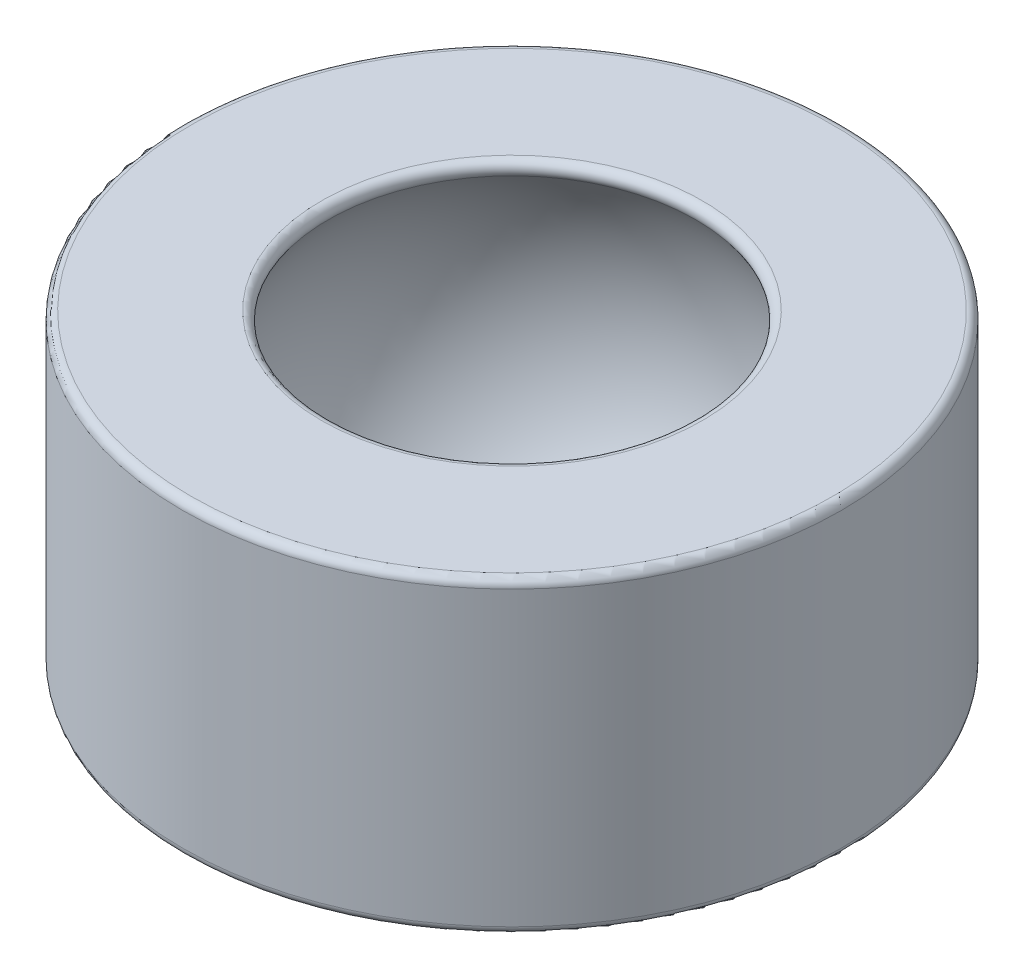
ISO-10303-21;
HEADER;
FILE_DESCRIPTION(('STEP AP214'),'2;1');
FILE_NAME('part.step','',(''),(''),'','','');
FILE_SCHEMA(('AUTOMOTIVE_DESIGN { 1 0 10303 214 1 1 1 1 }'));
ENDSEC;
DATA;
#1=APPLICATION_CONTEXT('core data for automotive mechanical design processes');
#2=APPLICATION_PROTOCOL_DEFINITION('international standard','automotive_design',2000,#1);
#3=PRODUCT_CONTEXT('',#1,'mechanical');
#4=PRODUCT('Part','Part','',(#3));
#5=PRODUCT_RELATED_PRODUCT_CATEGORY('part','',(#4));
#6=PRODUCT_DEFINITION_FORMATION('','',#4);
#7=PRODUCT_DEFINITION_CONTEXT('part definition',#1,'design');
#8=PRODUCT_DEFINITION('design','',#6,#7);
#9=PRODUCT_DEFINITION_SHAPE('','',#8);
#10=(LENGTH_UNIT() NAMED_UNIT(*) SI_UNIT(.MILLI.,.METRE.));
#11=(NAMED_UNIT(*) PLANE_ANGLE_UNIT() SI_UNIT($,.RADIAN.));
#12=(NAMED_UNIT(*) SI_UNIT($,.STERADIAN.) SOLID_ANGLE_UNIT());
#13=UNCERTAINTY_MEASURE_WITH_UNIT(LENGTH_MEASURE(1.E-05),#10,'distance_accuracy_value','');
#14=(GEOMETRIC_REPRESENTATION_CONTEXT(3) GLOBAL_UNCERTAINTY_ASSIGNED_CONTEXT((#13)) GLOBAL_UNIT_ASSIGNED_CONTEXT((#10,
#11,#12)) REPRESENTATION_CONTEXT('',''));
#15=CARTESIAN_POINT('',(0.,0.,0.));
#16=DIRECTION('',(0.,0.,1.));
#17=DIRECTION('',(1.,0.,0.));
#18=AXIS2_PLACEMENT_3D('',#15,#16,#17);
#19=CARTESIAN_POINT('',(0.,-1.875,0.));
#20=DIRECTION('',(0.,1.,0.));
#21=DIRECTION('',(0.,0.,1.));
#22=AXIS2_PLACEMENT_3D('',#19,#20,#21);
#23=CYLINDRICAL_SURFACE('',#22,4.);
#24=CARTESIAN_POINT('',(0.,-1.775,0.));
#25=DIRECTION('',(0.,1.,0.));
#26=DIRECTION('',(0.,0.,1.));
#27=AXIS2_PLACEMENT_3D('',#24,#25,#26);
#28=CIRCLE('',#27,4.);
#29=CARTESIAN_POINT('',(0.,-1.775,4.));
#30=VERTEX_POINT('',#29);
#31=EDGE_CURVE('E10',#30,#30,#28,.T.);
#32=ORIENTED_EDGE('',*,*,#31,.T.);
#33=EDGE_LOOP('',(#32));
#34=FACE_BOUND('',#33,.T.);
#35=CARTESIAN_POINT('',(0.,1.775,0.));
#36=DIRECTION('',(0.,1.,0.));
#37=DIRECTION('',(0.,0.,1.));
#38=AXIS2_PLACEMENT_3D('',#35,#36,#37);
#39=CIRCLE('',#38,4.);
#40=CARTESIAN_POINT('',(0.,1.775,4.));
#41=VERTEX_POINT('',#40);
#42=EDGE_CURVE('E46',#41,#41,#39,.F.);
#43=ORIENTED_EDGE('',*,*,#42,.T.);
#44=EDGE_LOOP('',(#43));
#45=FACE_BOUND('',#44,.T.);
#46=ADVANCED_FACE('F39',(#34,#45),#23,.T.);
#47=CARTESIAN_POINT('',(0.,-1.875,0.));
#48=DIRECTION('',(0.,1.,0.));
#49=DIRECTION('',(0.,0.,1.));
#50=AXIS2_PLACEMENT_3D('',#47,#48,#49);
#51=PLANE('',#50);
#52=CARTESIAN_POINT('',(0.,-1.875,0.));
#53=DIRECTION('',(0.,1.,0.));
#54=DIRECTION('',(0.,0.,1.));
#55=AXIS2_PLACEMENT_3D('',#52,#53,#54);
#56=CIRCLE('',#55,2.31189590876979);
#57=CARTESIAN_POINT('',(0.,-1.875,2.31189590876979));
#58=VERTEX_POINT('',#57);
#59=EDGE_CURVE('E65',#58,#58,#56,.T.);
#60=ORIENTED_EDGE('',*,*,#59,.T.);
#61=EDGE_LOOP('',(#60));
#62=FACE_BOUND('',#61,.T.);
#63=CARTESIAN_POINT('',(0.,-1.875,0.));
#64=DIRECTION('',(0.,1.,0.));
#65=DIRECTION('',(0.,0.,1.));
#66=AXIS2_PLACEMENT_3D('',#63,#64,#65);
#67=CIRCLE('',#66,3.9);
#68=CARTESIAN_POINT('',(0.,-1.875,3.9));
#69=VERTEX_POINT('',#68);
#70=EDGE_CURVE('E68',#69,#69,#67,.F.);
#71=ORIENTED_EDGE('',*,*,#70,.T.);
#72=EDGE_LOOP('',(#71));
#73=FACE_BOUND('',#72,.T.);
#74=ADVANCED_FACE('F72',(#62,#73),#51,.F.);
#75=CARTESIAN_POINT('',(0.,1.875,0.));
#76=DIRECTION('',(0.,1.,0.));
#77=DIRECTION('',(0.,0.,1.));
#78=AXIS2_PLACEMENT_3D('',#75,#76,#77);
#79=PLANE('',#78);
#80=CARTESIAN_POINT('',(0.,1.875,0.));
#81=DIRECTION('',(0.,1.,0.));
#82=DIRECTION('',(0.,0.,1.));
#83=AXIS2_PLACEMENT_3D('',#80,#81,#82);
#84=CIRCLE('',#83,2.31189590876979);
#85=CARTESIAN_POINT('',(0.,1.875,2.31189590876979));
#86=VERTEX_POINT('',#85);
#87=EDGE_CURVE('E50',#86,#86,#84,.F.);
#88=ORIENTED_EDGE('',*,*,#87,.T.);
#89=EDGE_LOOP('',(#88));
#90=FACE_BOUND('',#89,.T.);
#91=CARTESIAN_POINT('',(0.,1.875,0.));
#92=DIRECTION('',(0.,1.,0.));
#93=DIRECTION('',(0.,0.,1.));
#94=AXIS2_PLACEMENT_3D('',#91,#92,#93);
#95=CIRCLE('',#94,3.9);
#96=CARTESIAN_POINT('',(0.,1.875,3.9));
#97=VERTEX_POINT('',#96);
#98=EDGE_CURVE('E54',#97,#97,#95,.T.);
#99=ORIENTED_EDGE('',*,*,#98,.T.);
#100=EDGE_LOOP('',(#99));
#101=FACE_BOUND('',#100,.T.);
#102=ADVANCED_FACE('F91',(#90,#101),#79,.T.);
#103=CARTESIAN_POINT('',(0.,0.,0.));
#104=DIRECTION('',(0.,0.,-1.));
#105=DIRECTION('',(1.,0.,0.));
#106=AXIS2_PLACEMENT_3D('',#103,#104,#105);
#107=SPHERICAL_SURFACE('',#106,2.81470199042483);
#108=CARTESIAN_POINT('',(0.,0.,0.));
#109=DIRECTION('',(0.,1.,0.));
#110=DIRECTION('',(0.,0.,1.));
#111=AXIS2_PLACEMENT_3D('',#108,#109,#110);
#112=SPHERICAL_SURFACE('',#111,2.81470199042483);
#113=CARTESIAN_POINT('',(0.,-1.71410183593962,0.));
#114=DIRECTION('',(0.,1.,0.));
#115=DIRECTION('',(0.,0.,1.));
#116=AXIS2_PLACEMENT_3D('',#113,#114,#115);
#117=CIRCLE('',#116,2.23257747702738);
#118=CARTESIAN_POINT('',(0.,-1.71410183593962,2.23257747702738));
#119=VERTEX_POINT('',#118);
#120=EDGE_CURVE('E59',#119,#119,#117,.F.);
#121=ORIENTED_EDGE('',*,*,#120,.T.);
#122=EDGE_LOOP('',(#121));
#123=FACE_BOUND('',#122,.T.);
#124=CARTESIAN_POINT('',(0.,1.71410183593962,0.));
#125=DIRECTION('',(0.,-1.,0.));
#126=DIRECTION('',(0.,0.,-1.));
#127=AXIS2_PLACEMENT_3D('',#124,#125,#126);
#128=CIRCLE('',#127,2.23257747702738);
#129=CARTESIAN_POINT('',(0.,1.71410183593962,-2.23257747702738));
#130=VERTEX_POINT('',#129);
#131=EDGE_CURVE('E62',#130,#130,#128,.F.);
#132=ORIENTED_EDGE('',*,*,#131,.T.);
#133=EDGE_LOOP('',(#132));
#134=FACE_BOUND('',#133,.T.);
#135=ADVANCED_FACE('F97',(#123,#134),#112,.F.);
#136=CARTESIAN_POINT('',(0.,-1.775,0.));
#137=DIRECTION('',(0.,1.,0.));
#138=DIRECTION('',(0.,0.,1.));
#139=AXIS2_PLACEMENT_3D('',#136,#137,#138);
#140=TOROIDAL_SURFACE('',#139,2.31189590876979,0.1);
#141=ORIENTED_EDGE('',*,*,#120,.F.);
#142=EDGE_LOOP('',(#141));
#143=FACE_BOUND('',#142,.T.);
#144=ORIENTED_EDGE('',*,*,#59,.F.);
#145=EDGE_LOOP('',(#144));
#146=FACE_BOUND('',#145,.T.);
#147=ADVANCED_FACE('F83',(#143,#146),#140,.T.);
#148=CARTESIAN_POINT('',(0.,1.775,0.));
#149=DIRECTION('',(0.,1.,0.));
#150=DIRECTION('',(0.,0.,1.));
#151=AXIS2_PLACEMENT_3D('',#148,#149,#150);
#152=TOROIDAL_SURFACE('',#151,2.31189590876979,0.1);
#153=ORIENTED_EDGE('',*,*,#87,.F.);
#154=EDGE_LOOP('',(#153));
#155=FACE_BOUND('',#154,.T.);
#156=ORIENTED_EDGE('',*,*,#131,.F.);
#157=EDGE_LOOP('',(#156));
#158=FACE_BOUND('',#157,.T.);
#159=ADVANCED_FACE('F77',(#155,#158),#152,.T.);
#160=CARTESIAN_POINT('',(0.,-1.775,0.));
#161=DIRECTION('',(0.,1.,0.));
#162=DIRECTION('',(0.,0.,1.));
#163=AXIS2_PLACEMENT_3D('',#160,#161,#162);
#164=TOROIDAL_SURFACE('',#163,3.9,0.1);
#165=ORIENTED_EDGE('',*,*,#70,.F.);
#166=EDGE_LOOP('',(#165));
#167=FACE_BOUND('',#166,.T.);
#168=ORIENTED_EDGE('',*,*,#31,.F.);
#169=EDGE_LOOP('',(#168));
#170=FACE_BOUND('',#169,.T.);
#171=ADVANCED_FACE('F74',(#167,#170),#164,.T.);
#172=CARTESIAN_POINT('',(0.,1.775,0.));
#173=DIRECTION('',(0.,1.,0.));
#174=DIRECTION('',(0.,0.,1.));
#175=AXIS2_PLACEMENT_3D('',#172,#173,#174);
#176=TOROIDAL_SURFACE('',#175,3.9,0.1);
#177=ORIENTED_EDGE('',*,*,#42,.F.);
#178=EDGE_LOOP('',(#177));
#179=FACE_BOUND('',#178,.T.);
#180=ORIENTED_EDGE('',*,*,#98,.F.);
#181=EDGE_LOOP('',(#180));
#182=FACE_BOUND('',#181,.T.);
#183=ADVANCED_FACE('F41',(#179,#182),#176,.T.);
#184=CLOSED_SHELL('',(#46,#74,#102,#135,#147,#159,#171,#183));
#185=MANIFOLD_SOLID_BREP('B2',#184);
#186=ADVANCED_BREP_SHAPE_REPRESENTATION('',(#18,#185),#14);
#187=SHAPE_DEFINITION_REPRESENTATION(#9,#186);
ENDSEC;
END-ISO-10303-21;
